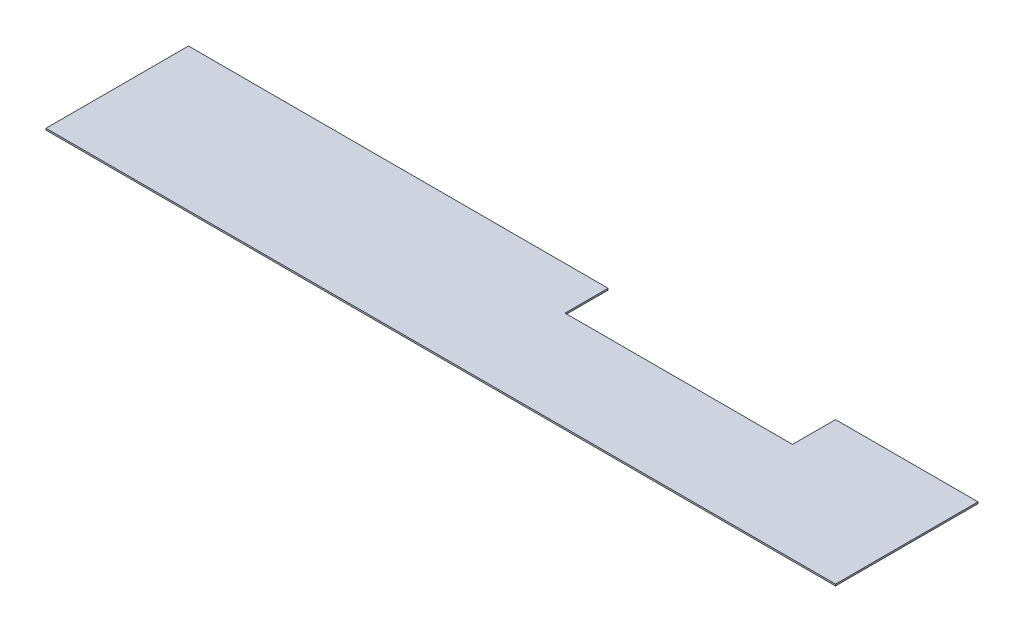
ISO-10303-21;
HEADER;
FILE_DESCRIPTION(('STEP AP214'),'2;1');
FILE_NAME('part.step','',(''),(''),'','','');
FILE_SCHEMA(('AUTOMOTIVE_DESIGN { 1 0 10303 214 1 1 1 1 }'));
ENDSEC;
DATA;
#1=APPLICATION_CONTEXT('core data for automotive mechanical design processes');
#2=APPLICATION_PROTOCOL_DEFINITION('international standard','automotive_design',2000,#1);
#3=PRODUCT_CONTEXT('',#1,'mechanical');
#4=PRODUCT('Part','Part','',(#3));
#5=PRODUCT_RELATED_PRODUCT_CATEGORY('part','',(#4));
#6=PRODUCT_DEFINITION_FORMATION('','',#4);
#7=PRODUCT_DEFINITION_CONTEXT('part definition',#1,'design');
#8=PRODUCT_DEFINITION('design','',#6,#7);
#9=PRODUCT_DEFINITION_SHAPE('','',#8);
#10=(LENGTH_UNIT() NAMED_UNIT(*) SI_UNIT(.MILLI.,.METRE.));
#11=(NAMED_UNIT(*) PLANE_ANGLE_UNIT() SI_UNIT($,.RADIAN.));
#12=(NAMED_UNIT(*) SI_UNIT($,.STERADIAN.) SOLID_ANGLE_UNIT());
#13=UNCERTAINTY_MEASURE_WITH_UNIT(LENGTH_MEASURE(1.E-05),#10,'distance_accuracy_value','');
#14=(GEOMETRIC_REPRESENTATION_CONTEXT(3) GLOBAL_UNCERTAINTY_ASSIGNED_CONTEXT((#13)) GLOBAL_UNIT_ASSIGNED_CONTEXT((#10,
#11,#12)) REPRESENTATION_CONTEXT('',''));
#15=CARTESIAN_POINT('',(0.,0.,0.));
#16=DIRECTION('',(0.,0.,1.));
#17=DIRECTION('',(1.,0.,0.));
#18=AXIS2_PLACEMENT_3D('',#15,#16,#17);
#19=CARTESIAN_POINT('',(-762.000000000001,3.175,-137.5));
#20=DIRECTION('',(0.,0.,1.));
#21=DIRECTION('',(1.,0.,0.));
#22=AXIS2_PLACEMENT_3D('',#19,#20,#21);
#23=PLANE('',#22);
#24=DIRECTION('',(-1.,0.,0.));
#25=VECTOR('',#24,1.);
#26=CARTESIAN_POINT('',(-762.000000000001,3.175,-137.5));
#27=LINE('',#26,#25);
#28=CARTESIAN_POINT('',(47.9999999999992,3.175,-137.5));
#29=VERTEX_POINT('',#28);
#30=CARTESIAN_POINT('',(-762.000000000001,3.175,-137.5));
#31=VERTEX_POINT('',#30);
#32=EDGE_CURVE('E133',#29,#31,#27,.T.);
#33=ORIENTED_EDGE('',*,*,#32,.F.);
#34=DIRECTION('',(0.,-1.,0.));
#35=VECTOR('',#34,1.);
#36=CARTESIAN_POINT('',(47.9999999999992,3.176,-137.5));
#37=LINE('',#36,#35);
#38=CARTESIAN_POINT('',(47.9999999999992,0.,-137.5));
#39=VERTEX_POINT('',#38);
#40=EDGE_CURVE('E120',#29,#39,#37,.T.);
#41=ORIENTED_EDGE('',*,*,#40,.T.);
#42=DIRECTION('',(-1.,0.,0.));
#43=VECTOR('',#42,1.);
#44=CARTESIAN_POINT('',(-762.000000000001,0.,-137.5));
#45=LINE('',#44,#43);
#46=CARTESIAN_POINT('',(-762.000000000001,0.,-137.5));
#47=VERTEX_POINT('',#46);
#48=EDGE_CURVE('E152',#39,#47,#45,.T.);
#49=ORIENTED_EDGE('',*,*,#48,.T.);
#50=DIRECTION('',(0.,-1.,0.));
#51=VECTOR('',#50,1.);
#52=CARTESIAN_POINT('',(-762.000000000001,3.175,-137.5));
#53=LINE('',#52,#51);
#54=EDGE_CURVE('E53',#31,#47,#53,.T.);
#55=ORIENTED_EDGE('',*,*,#54,.F.);
#56=EDGE_LOOP('',(#33,#41,#49,#55));
#57=FACE_BOUND('',#56,.T.);
#58=ADVANCED_FACE('F45',(#57),#23,.F.);
#59=CARTESIAN_POINT('',(761.999999999999,3.175,137.5));
#60=DIRECTION('',(-1.,0.,0.));
#61=DIRECTION('',(0.,0.,1.));
#62=AXIS2_PLACEMENT_3D('',#59,#60,#61);
#63=PLANE('',#62);
#64=DIRECTION('',(0.,0.,-1.));
#65=VECTOR('',#64,1.);
#66=CARTESIAN_POINT('',(761.999999999999,0.,137.5));
#67=LINE('',#66,#65);
#68=CARTESIAN_POINT('',(761.999999999999,0.,137.5));
#69=VERTEX_POINT('',#68);
#70=CARTESIAN_POINT('',(761.999999999999,0.,-137.5));
#71=VERTEX_POINT('',#70);
#72=EDGE_CURVE('E149',#69,#71,#67,.T.);
#73=ORIENTED_EDGE('',*,*,#72,.T.);
#74=DIRECTION('',(0.,-1.,0.));
#75=VECTOR('',#74,1.);
#76=CARTESIAN_POINT('',(761.999999999999,3.175,-137.5));
#77=LINE('',#76,#75);
#78=CARTESIAN_POINT('',(761.999999999999,3.175,-137.5));
#79=VERTEX_POINT('',#78);
#80=EDGE_CURVE('E11',#79,#71,#77,.T.);
#81=ORIENTED_EDGE('',*,*,#80,.F.);
#82=DIRECTION('',(0.,0.,-1.));
#83=VECTOR('',#82,1.);
#84=CARTESIAN_POINT('',(761.999999999999,3.175,137.5));
#85=LINE('',#84,#83);
#86=CARTESIAN_POINT('',(761.999999999999,3.175,137.5));
#87=VERTEX_POINT('',#86);
#88=EDGE_CURVE('E141',#87,#79,#85,.T.);
#89=ORIENTED_EDGE('',*,*,#88,.F.);
#90=DIRECTION('',(0.,-1.,0.));
#91=VECTOR('',#90,1.);
#92=CARTESIAN_POINT('',(761.999999999999,3.175,137.5));
#93=LINE('',#92,#91);
#94=EDGE_CURVE('E148',#87,#69,#93,.T.);
#95=ORIENTED_EDGE('',*,*,#94,.T.);
#96=EDGE_LOOP('',(#73,#81,#89,#95));
#97=FACE_BOUND('',#96,.T.);
#98=ADVANCED_FACE('F47',(#97),#63,.F.);
#99=CARTESIAN_POINT('',(486.999999999999,0.,-137.5));
#100=VERTEX_POINT('',#99);
#101=EDGE_CURVE('E154',#71,#100,#45,.T.);
#102=ORIENTED_EDGE('',*,*,#101,.T.);
#103=DIRECTION('',(0.,-1.,0.));
#104=VECTOR('',#103,1.);
#105=CARTESIAN_POINT('',(486.999999999999,3.176,-137.5));
#106=LINE('',#105,#104);
#107=CARTESIAN_POINT('',(486.999999999999,3.175,-137.5));
#108=VERTEX_POINT('',#107);
#109=EDGE_CURVE('E60',#108,#100,#106,.T.);
#110=ORIENTED_EDGE('',*,*,#109,.F.);
#111=EDGE_CURVE('E96',#79,#108,#27,.T.);
#112=ORIENTED_EDGE('',*,*,#111,.F.);
#113=ORIENTED_EDGE('',*,*,#80,.T.);
#114=EDGE_LOOP('',(#102,#110,#112,#113));
#115=FACE_BOUND('',#114,.T.);
#116=ADVANCED_FACE('F181',(#115),#23,.F.);
#117=CARTESIAN_POINT('',(-762.000000000001,3.175,137.5));
#118=DIRECTION('',(1.,0.,0.));
#119=DIRECTION('',(0.,0.,-1.));
#120=AXIS2_PLACEMENT_3D('',#117,#118,#119);
#121=PLANE('',#120);
#122=DIRECTION('',(0.,0.,1.));
#123=VECTOR('',#122,1.);
#124=CARTESIAN_POINT('',(-762.000000000001,0.,137.5));
#125=LINE('',#124,#123);
#126=CARTESIAN_POINT('',(-762.000000000001,0.,137.5));
#127=VERTEX_POINT('',#126);
#128=EDGE_CURVE('E157',#47,#127,#125,.T.);
#129=ORIENTED_EDGE('',*,*,#128,.T.);
#130=DIRECTION('',(0.,-1.,0.));
#131=VECTOR('',#130,1.);
#132=CARTESIAN_POINT('',(-762.000000000001,3.175,137.5));
#133=LINE('',#132,#131);
#134=CARTESIAN_POINT('',(-762.000000000001,3.175,137.5));
#135=VERTEX_POINT('',#134);
#136=EDGE_CURVE('E161',#135,#127,#133,.T.);
#137=ORIENTED_EDGE('',*,*,#136,.F.);
#138=DIRECTION('',(0.,0.,1.));
#139=VECTOR('',#138,1.);
#140=CARTESIAN_POINT('',(-762.000000000001,3.175,137.5));
#141=LINE('',#140,#139);
#142=EDGE_CURVE('E143',#31,#135,#141,.T.);
#143=ORIENTED_EDGE('',*,*,#142,.F.);
#144=ORIENTED_EDGE('',*,*,#54,.T.);
#145=EDGE_LOOP('',(#129,#137,#143,#144));
#146=FACE_BOUND('',#145,.T.);
#147=ADVANCED_FACE('F164',(#146),#121,.F.);
#148=CARTESIAN_POINT('',(-762.000000000001,3.175,137.5));
#149=DIRECTION('',(0.,0.,-1.));
#150=DIRECTION('',(-1.,0.,0.));
#151=AXIS2_PLACEMENT_3D('',#148,#149,#150);
#152=PLANE('',#151);
#153=DIRECTION('',(1.,0.,0.));
#154=VECTOR('',#153,1.);
#155=CARTESIAN_POINT('',(-762.000000000001,0.,137.5));
#156=LINE('',#155,#154);
#157=EDGE_CURVE('E90',#127,#69,#156,.T.);
#158=ORIENTED_EDGE('',*,*,#157,.T.);
#159=ORIENTED_EDGE('',*,*,#94,.F.);
#160=DIRECTION('',(1.,0.,0.));
#161=VECTOR('',#160,1.);
#162=CARTESIAN_POINT('',(-762.000000000001,3.175,137.5));
#163=LINE('',#162,#161);
#164=EDGE_CURVE('E69',#135,#87,#163,.T.);
#165=ORIENTED_EDGE('',*,*,#164,.F.);
#166=ORIENTED_EDGE('',*,*,#136,.T.);
#167=EDGE_LOOP('',(#158,#159,#165,#166));
#168=FACE_BOUND('',#167,.T.);
#169=ADVANCED_FACE('F172',(#168),#152,.F.);
#170=CARTESIAN_POINT('',(0.,3.175,0.));
#171=DIRECTION('',(0.,-1.,0.));
#172=DIRECTION('',(0.,0.,-1.));
#173=AXIS2_PLACEMENT_3D('',#170,#171,#172);
#174=PLANE('',#173);
#175=DIRECTION('',(1.,0.,0.));
#176=VECTOR('',#175,1.);
#177=CARTESIAN_POINT('',(47.9999999999991,3.175,-54.5));
#178=LINE('',#177,#176);
#179=CARTESIAN_POINT('',(47.9999999999991,3.175,-54.5));
#180=VERTEX_POINT('',#179);
#181=CARTESIAN_POINT('',(486.999999999999,3.175,-54.5));
#182=VERTEX_POINT('',#181);
#183=EDGE_CURVE('E137',#180,#182,#178,.T.);
#184=ORIENTED_EDGE('',*,*,#183,.F.);
#185=DIRECTION('',(0.,0.,1.));
#186=VECTOR('',#185,1.);
#187=CARTESIAN_POINT('',(47.9999999999992,3.175,-137.5));
#188=LINE('',#187,#186);
#189=EDGE_CURVE('E123',#29,#180,#188,.T.);
#190=ORIENTED_EDGE('',*,*,#189,.F.);
#191=ORIENTED_EDGE('',*,*,#32,.T.);
#192=ORIENTED_EDGE('',*,*,#142,.T.);
#193=ORIENTED_EDGE('',*,*,#164,.T.);
#194=ORIENTED_EDGE('',*,*,#88,.T.);
#195=ORIENTED_EDGE('',*,*,#111,.T.);
#196=DIRECTION('',(0.,0.,-1.));
#197=VECTOR('',#196,1.);
#198=CARTESIAN_POINT('',(486.999999999999,3.175,-137.5));
#199=LINE('',#198,#197);
#200=EDGE_CURVE('E192',#182,#108,#199,.T.);
#201=ORIENTED_EDGE('',*,*,#200,.F.);
#202=EDGE_LOOP('',(#184,#190,#191,#192,#193,#194,#195,#201));
#203=FACE_BOUND('',#202,.T.);
#204=ADVANCED_FACE('F132',(#203),#174,.F.);
#205=CARTESIAN_POINT('',(0.,0.,0.));
#206=DIRECTION('',(0.,-1.,0.));
#207=DIRECTION('',(0.,0.,-1.));
#208=AXIS2_PLACEMENT_3D('',#205,#206,#207);
#209=PLANE('',#208);
#210=DIRECTION('',(0.,0.,-1.));
#211=VECTOR('',#210,1.);
#212=CARTESIAN_POINT('',(47.9999999999992,0.,-137.5));
#213=LINE('',#212,#211);
#214=CARTESIAN_POINT('',(47.9999999999991,0.,-54.5));
#215=VERTEX_POINT('',#214);
#216=EDGE_CURVE('E126',#215,#39,#213,.T.);
#217=ORIENTED_EDGE('',*,*,#216,.F.);
#218=DIRECTION('',(-1.,0.,0.));
#219=VECTOR('',#218,1.);
#220=CARTESIAN_POINT('',(47.9999999999991,0.,-54.5));
#221=LINE('',#220,#219);
#222=CARTESIAN_POINT('',(486.999999999999,0.,-54.5));
#223=VERTEX_POINT('',#222);
#224=EDGE_CURVE('E130',#223,#215,#221,.T.);
#225=ORIENTED_EDGE('',*,*,#224,.F.);
#226=DIRECTION('',(0.,0.,1.));
#227=VECTOR('',#226,1.);
#228=CARTESIAN_POINT('',(486.999999999999,0.,-137.5));
#229=LINE('',#228,#227);
#230=EDGE_CURVE('E197',#100,#223,#229,.T.);
#231=ORIENTED_EDGE('',*,*,#230,.F.);
#232=ORIENTED_EDGE('',*,*,#101,.F.);
#233=ORIENTED_EDGE('',*,*,#72,.F.);
#234=ORIENTED_EDGE('',*,*,#157,.F.);
#235=ORIENTED_EDGE('',*,*,#128,.F.);
#236=ORIENTED_EDGE('',*,*,#48,.F.);
#237=EDGE_LOOP('',(#217,#225,#231,#232,#233,#234,#235,#236));
#238=FACE_BOUND('',#237,.T.);
#239=ADVANCED_FACE('F167',(#238),#209,.T.);
#240=CARTESIAN_POINT('',(47.9999999999992,3.176,-137.5));
#241=DIRECTION('',(-1.,0.,0.));
#242=DIRECTION('',(0.,0.,1.));
#243=AXIS2_PLACEMENT_3D('',#240,#241,#242);
#244=PLANE('',#243);
#245=ORIENTED_EDGE('',*,*,#189,.T.);
#246=DIRECTION('',(0.,-1.,0.));
#247=VECTOR('',#246,1.);
#248=CARTESIAN_POINT('',(47.9999999999991,3.176,-54.5));
#249=LINE('',#248,#247);
#250=EDGE_CURVE('E153',#180,#215,#249,.T.);
#251=ORIENTED_EDGE('',*,*,#250,.T.);
#252=ORIENTED_EDGE('',*,*,#216,.T.);
#253=ORIENTED_EDGE('',*,*,#40,.F.);
#254=EDGE_LOOP('',(#245,#251,#252,#253));
#255=FACE_BOUND('',#254,.T.);
#256=ADVANCED_FACE('F122',(#255),#244,.F.);
#257=CARTESIAN_POINT('',(47.9999999999991,3.176,-54.5));
#258=DIRECTION('',(0.,0.,1.));
#259=DIRECTION('',(1.,0.,0.));
#260=AXIS2_PLACEMENT_3D('',#257,#258,#259);
#261=PLANE('',#260);
#262=ORIENTED_EDGE('',*,*,#183,.T.);
#263=DIRECTION('',(0.,-1.,0.));
#264=VECTOR('',#263,1.);
#265=CARTESIAN_POINT('',(486.999999999999,3.176,-54.5));
#266=LINE('',#265,#264);
#267=EDGE_CURVE('E190',#182,#223,#266,.T.);
#268=ORIENTED_EDGE('',*,*,#267,.T.);
#269=ORIENTED_EDGE('',*,*,#224,.T.);
#270=ORIENTED_EDGE('',*,*,#250,.F.);
#271=EDGE_LOOP('',(#262,#268,#269,#270));
#272=FACE_BOUND('',#271,.T.);
#273=ADVANCED_FACE('F203',(#272),#261,.F.);
#274=CARTESIAN_POINT('',(486.999999999999,3.176,-137.5));
#275=DIRECTION('',(1.,0.,0.));
#276=DIRECTION('',(0.,0.,-1.));
#277=AXIS2_PLACEMENT_3D('',#274,#275,#276);
#278=PLANE('',#277);
#279=ORIENTED_EDGE('',*,*,#200,.T.);
#280=ORIENTED_EDGE('',*,*,#109,.T.);
#281=ORIENTED_EDGE('',*,*,#230,.T.);
#282=ORIENTED_EDGE('',*,*,#267,.F.);
#283=EDGE_LOOP('',(#279,#280,#281,#282));
#284=FACE_BOUND('',#283,.T.);
#285=ADVANCED_FACE('F205',(#284),#278,.F.);
#286=CLOSED_SHELL('',(#58,#98,#116,#147,#169,#204,#239,#256,#273,#285));
#287=MANIFOLD_SOLID_BREP('B2',#286);
#288=ADVANCED_BREP_SHAPE_REPRESENTATION('',(#18,#287),#14);
#289=SHAPE_DEFINITION_REPRESENTATION(#9,#288);
ENDSEC;
END-ISO-10303-21;
